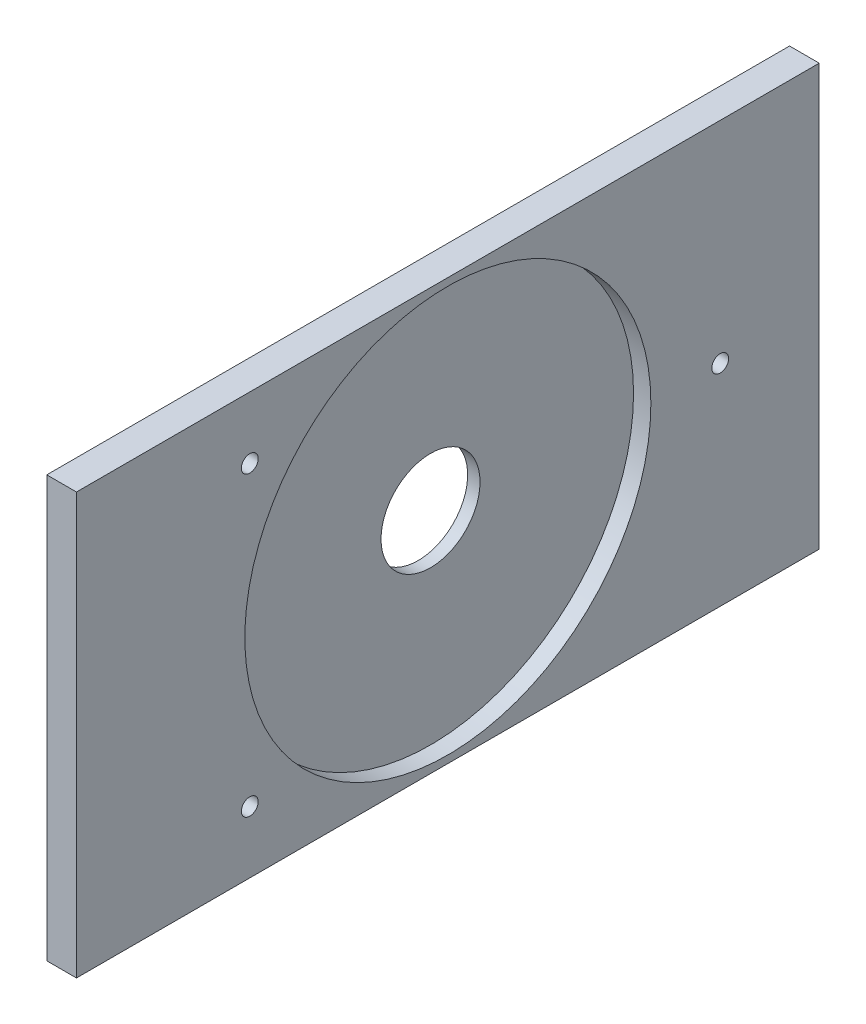
ISO-10303-21;
HEADER;
FILE_DESCRIPTION(('STEP AP214'),'2;1');
FILE_NAME('part.step','',(''),(''),'','','');
FILE_SCHEMA(('AUTOMOTIVE_DESIGN { 1 0 10303 214 1 1 1 1 }'));
ENDSEC;
DATA;
#1=APPLICATION_CONTEXT('core data for automotive mechanical design processes');
#2=APPLICATION_PROTOCOL_DEFINITION('international standard','automotive_design',2000,#1);
#3=PRODUCT_CONTEXT('',#1,'mechanical');
#4=PRODUCT('Part','Part','',(#3));
#5=PRODUCT_RELATED_PRODUCT_CATEGORY('part','',(#4));
#6=PRODUCT_DEFINITION_FORMATION('','',#4);
#7=PRODUCT_DEFINITION_CONTEXT('part definition',#1,'design');
#8=PRODUCT_DEFINITION('design','',#6,#7);
#9=PRODUCT_DEFINITION_SHAPE('','',#8);
#10=(LENGTH_UNIT() NAMED_UNIT(*) SI_UNIT(.MILLI.,.METRE.));
#11=(NAMED_UNIT(*) PLANE_ANGLE_UNIT() SI_UNIT($,.RADIAN.));
#12=(NAMED_UNIT(*) SI_UNIT($,.STERADIAN.) SOLID_ANGLE_UNIT());
#13=UNCERTAINTY_MEASURE_WITH_UNIT(LENGTH_MEASURE(1.E-05),#10,'distance_accuracy_value','');
#14=(GEOMETRIC_REPRESENTATION_CONTEXT(3) GLOBAL_UNCERTAINTY_ASSIGNED_CONTEXT((#13)) GLOBAL_UNIT_ASSIGNED_CONTEXT((#10,
#11,#12)) REPRESENTATION_CONTEXT('',''));
#15=CARTESIAN_POINT('',(0.,0.,0.));
#16=DIRECTION('',(0.,0.,1.));
#17=DIRECTION('',(1.,0.,0.));
#18=AXIS2_PLACEMENT_3D('',#15,#16,#17);
#19=CARTESIAN_POINT('',(141.167976474236,523.937350332489,386.309777683274));
#20=DIRECTION('',(0.,0.,-1.));
#21=DIRECTION('',(-1.,0.,0.));
#22=AXIS2_PLACEMENT_3D('',#19,#20,#21);
#23=PLANE('',#22);
#24=DIRECTION('',(0.,1.,0.));
#25=VECTOR('',#24,1.);
#26=CARTESIAN_POINT('',(-31.741420021431,523.937350332489,386.309777683274));
#27=LINE('',#26,#25);
#28=CARTESIAN_POINT('',(-31.741420021431,438.937350332489,386.309777683274));
#29=VERTEX_POINT('',#28);
#30=CARTESIAN_POINT('',(-31.741420021431,523.937350332489,386.309777683274));
#31=VERTEX_POINT('',#30);
#32=EDGE_CURVE('E42',#29,#31,#27,.T.);
#33=ORIENTED_EDGE('',*,*,#32,.F.);
#34=DIRECTION('',(-1.,0.,0.));
#35=VECTOR('',#34,1.);
#36=CARTESIAN_POINT('',(141.167976474236,438.937350332489,386.309777683274));
#37=LINE('',#36,#35);
#38=CARTESIAN_POINT('',(-37.741420021431,438.937350332489,386.309777683274));
#39=VERTEX_POINT('',#38);
#40=EDGE_CURVE('E70',#29,#39,#37,.T.);
#41=ORIENTED_EDGE('',*,*,#40,.T.);
#42=DIRECTION('',(0.,-1.,0.));
#43=VECTOR('',#42,1.);
#44=CARTESIAN_POINT('',(-37.741420021431,523.937350332489,386.309777683274));
#45=LINE('',#44,#43);
#46=CARTESIAN_POINT('',(-37.741420021431,523.937350332489,386.309777683274));
#47=VERTEX_POINT('',#46);
#48=EDGE_CURVE('E74',#47,#39,#45,.T.);
#49=ORIENTED_EDGE('',*,*,#48,.F.);
#50=DIRECTION('',(-1.,0.,0.));
#51=VECTOR('',#50,1.);
#52=CARTESIAN_POINT('',(141.167976474236,523.937350332489,386.309777683274));
#53=LINE('',#52,#51);
#54=EDGE_CURVE('E103',#31,#47,#53,.T.);
#55=ORIENTED_EDGE('',*,*,#54,.F.);
#56=EDGE_LOOP('',(#33,#41,#49,#55));
#57=FACE_BOUND('',#56,.T.);
#58=ADVANCED_FACE('F33',(#57),#23,.T.);
#59=CARTESIAN_POINT('',(141.167976474236,523.937350332489,386.309777683274));
#60=DIRECTION('',(0.,1.,0.));
#61=DIRECTION('',(-1.,0.,0.));
#62=AXIS2_PLACEMENT_3D('',#59,#60,#61);
#63=PLANE('',#62);
#64=DIRECTION('',(0.,0.,1.));
#65=VECTOR('',#64,1.);
#66=CARTESIAN_POINT('',(-31.741420021431,523.937350332489,386.309777683274));
#67=LINE('',#66,#65);
#68=CARTESIAN_POINT('',(-31.741420021431,523.937350332489,536.309777683274));
#69=VERTEX_POINT('',#68);
#70=EDGE_CURVE('E48',#31,#69,#67,.T.);
#71=ORIENTED_EDGE('',*,*,#70,.F.);
#72=ORIENTED_EDGE('',*,*,#54,.T.);
#73=DIRECTION('',(0.,0.,-1.));
#74=VECTOR('',#73,1.);
#75=CARTESIAN_POINT('',(-37.741420021431,523.937350332489,386.309777683274));
#76=LINE('',#75,#74);
#77=CARTESIAN_POINT('',(-37.741420021431,523.937350332489,536.309777683274));
#78=VERTEX_POINT('',#77);
#79=EDGE_CURVE('E78',#78,#47,#76,.T.);
#80=ORIENTED_EDGE('',*,*,#79,.F.);
#81=DIRECTION('',(-1.,0.,0.));
#82=VECTOR('',#81,1.);
#83=CARTESIAN_POINT('',(141.167976474236,523.937350332489,536.309777683274));
#84=LINE('',#83,#82);
#85=EDGE_CURVE('E107',#69,#78,#84,.T.);
#86=ORIENTED_EDGE('',*,*,#85,.F.);
#87=EDGE_LOOP('',(#71,#72,#80,#86));
#88=FACE_BOUND('',#87,.T.);
#89=ADVANCED_FACE('F113',(#88),#63,.T.);
#90=CARTESIAN_POINT('',(141.167976474236,523.937350332489,536.309777683274));
#91=DIRECTION('',(0.,0.,1.));
#92=DIRECTION('',(1.,0.,0.));
#93=AXIS2_PLACEMENT_3D('',#90,#91,#92);
#94=PLANE('',#93);
#95=DIRECTION('',(0.,-1.,0.));
#96=VECTOR('',#95,1.);
#97=CARTESIAN_POINT('',(-31.741420021431,523.937350332489,536.309777683274));
#98=LINE('',#97,#96);
#99=CARTESIAN_POINT('',(-31.741420021431,438.937350332489,536.309777683274));
#100=VERTEX_POINT('',#99);
#101=EDGE_CURVE('E101',#69,#100,#98,.T.);
#102=ORIENTED_EDGE('',*,*,#101,.F.);
#103=ORIENTED_EDGE('',*,*,#85,.T.);
#104=DIRECTION('',(0.,1.,0.));
#105=VECTOR('',#104,1.);
#106=CARTESIAN_POINT('',(-37.741420021431,523.937350332489,536.309777683274));
#107=LINE('',#106,#105);
#108=CARTESIAN_POINT('',(-37.741420021431,438.937350332489,536.309777683274));
#109=VERTEX_POINT('',#108);
#110=EDGE_CURVE('E87',#109,#78,#107,.T.);
#111=ORIENTED_EDGE('',*,*,#110,.F.);
#112=DIRECTION('',(-1.,0.,0.));
#113=VECTOR('',#112,1.);
#114=CARTESIAN_POINT('',(141.167976474236,438.937350332489,536.309777683274));
#115=LINE('',#114,#113);
#116=EDGE_CURVE('E77',#100,#109,#115,.T.);
#117=ORIENTED_EDGE('',*,*,#116,.F.);
#118=EDGE_LOOP('',(#102,#103,#111,#117));
#119=FACE_BOUND('',#118,.T.);
#120=ADVANCED_FACE('F111',(#119),#94,.T.);
#121=CARTESIAN_POINT('',(141.167976474236,438.937350332489,386.309777683274));
#122=DIRECTION('',(0.,-1.,0.));
#123=DIRECTION('',(1.,0.,0.));
#124=AXIS2_PLACEMENT_3D('',#121,#122,#123);
#125=PLANE('',#124);
#126=DIRECTION('',(0.,0.,-1.));
#127=VECTOR('',#126,1.);
#128=CARTESIAN_POINT('',(-31.741420021431,438.937350332489,386.309777683274));
#129=LINE('',#128,#127);
#130=EDGE_CURVE('E12',#100,#29,#129,.T.);
#131=ORIENTED_EDGE('',*,*,#130,.F.);
#132=ORIENTED_EDGE('',*,*,#116,.T.);
#133=DIRECTION('',(0.,0.,1.));
#134=VECTOR('',#133,1.);
#135=CARTESIAN_POINT('',(-37.741420021431,438.937350332489,386.309777683274));
#136=LINE('',#135,#134);
#137=EDGE_CURVE('E81',#39,#109,#136,.T.);
#138=ORIENTED_EDGE('',*,*,#137,.F.);
#139=ORIENTED_EDGE('',*,*,#40,.F.);
#140=EDGE_LOOP('',(#131,#132,#138,#139));
#141=FACE_BOUND('',#140,.T.);
#142=ADVANCED_FACE('F82',(#141),#125,.T.);
#143=CARTESIAN_POINT('',(-31.741420021431,491.437350332474,461.309760229981));
#144=DIRECTION('',(-1.,0.,0.));
#145=DIRECTION('',(0.,1.74532925137014E-06,0.999999999998477));
#146=AXIS2_PLACEMENT_3D('',#143,#144,#145);
#147=PLANE('',#146);
#148=CARTESIAN_POINT('',(-31.741420021431,451.437350332489,501.309777683274));
#149=DIRECTION('',(-1.,0.,0.));
#150=DIRECTION('',(0.,0.,1.));
#151=AXIS2_PLACEMENT_3D('',#148,#149,#150);
#152=CIRCLE('',#151,1.70000000000008);
#153=CARTESIAN_POINT('',(-31.741420021431,451.437350332489,503.009777683274));
#154=VERTEX_POINT('',#153);
#155=EDGE_CURVE('E137',#154,#154,#152,.T.);
#156=ORIENTED_EDGE('',*,*,#155,.T.);
#157=EDGE_LOOP('',(#156));
#158=FACE_BOUND('',#157,.T.);
#159=CARTESIAN_POINT('',(-31.741420021431,481.437350332489,406.309777683274));
#160=DIRECTION('',(-1.,0.,0.));
#161=DIRECTION('',(0.,0.,1.));
#162=AXIS2_PLACEMENT_3D('',#159,#160,#161);
#163=CIRCLE('',#162,1.69999999999995);
#164=CARTESIAN_POINT('',(-31.741420021431,481.437350332489,408.009777683274));
#165=VERTEX_POINT('',#164);
#166=EDGE_CURVE('E141',#165,#165,#163,.T.);
#167=ORIENTED_EDGE('',*,*,#166,.T.);
#168=EDGE_LOOP('',(#167));
#169=FACE_BOUND('',#168,.T.);
#170=CARTESIAN_POINT('',(-31.741420021431,511.437350332489,501.309777683274));
#171=DIRECTION('',(-1.,0.,0.));
#172=DIRECTION('',(0.,0.,1.));
#173=AXIS2_PLACEMENT_3D('',#170,#171,#172);
#174=CIRCLE('',#173,1.70000000000006);
#175=CARTESIAN_POINT('',(-31.741420021431,511.437350332489,503.009777683274));
#176=VERTEX_POINT('',#175);
#177=EDGE_CURVE('E145',#176,#176,#174,.T.);
#178=ORIENTED_EDGE('',*,*,#177,.T.);
#179=EDGE_LOOP('',(#178));
#180=FACE_BOUND('',#179,.T.);
#181=CARTESIAN_POINT('',(-31.741420021431,481.437350332489,461.309777683274));
#182=DIRECTION('',(1.,0.,0.));
#183=DIRECTION('',(0.,0.,-1.));
#184=AXIS2_PLACEMENT_3D('',#181,#182,#183);
#185=CIRCLE('',#184,41.);
#186=CARTESIAN_POINT('',(-31.741420021431,481.437350332489,420.309777683274));
#187=VERTEX_POINT('',#186);
#188=EDGE_CURVE('E95',#187,#187,#185,.T.);
#189=ORIENTED_EDGE('',*,*,#188,.F.);
#190=EDGE_LOOP('',(#189));
#191=FACE_BOUND('',#190,.T.);
#192=ORIENTED_EDGE('',*,*,#32,.T.);
#193=ORIENTED_EDGE('',*,*,#70,.T.);
#194=ORIENTED_EDGE('',*,*,#101,.T.);
#195=ORIENTED_EDGE('',*,*,#130,.T.);
#196=EDGE_LOOP('',(#192,#193,#194,#195));
#197=FACE_BOUND('',#196,.T.);
#198=ADVANCED_FACE('F122',(#158,#169,#180,#191,#197),#147,.F.);
#199=CARTESIAN_POINT('',(-37.741420021431,0.,0.));
#200=DIRECTION('',(-1.,0.,0.));
#201=DIRECTION('',(0.,0.,1.));
#202=AXIS2_PLACEMENT_3D('',#199,#200,#201);
#203=PLANE('',#202);
#204=CARTESIAN_POINT('',(-37.741420021431,451.437350332489,501.309777683274));
#205=DIRECTION('',(-1.,0.,0.));
#206=DIRECTION('',(0.,0.,1.));
#207=AXIS2_PLACEMENT_3D('',#204,#205,#206);
#208=CIRCLE('',#207,1.70000000000008);
#209=CARTESIAN_POINT('',(-37.741420021431,451.437350332489,503.009777683274));
#210=VERTEX_POINT('',#209);
#211=EDGE_CURVE('E166',#210,#210,#208,.T.);
#212=ORIENTED_EDGE('',*,*,#211,.F.);
#213=EDGE_LOOP('',(#212));
#214=FACE_BOUND('',#213,.T.);
#215=CARTESIAN_POINT('',(-37.741420021431,481.437350332489,406.309777683274));
#216=DIRECTION('',(-1.,0.,0.));
#217=DIRECTION('',(0.,0.,1.));
#218=AXIS2_PLACEMENT_3D('',#215,#216,#217);
#219=CIRCLE('',#218,1.69999999999995);
#220=CARTESIAN_POINT('',(-37.741420021431,481.437350332489,408.009777683274));
#221=VERTEX_POINT('',#220);
#222=EDGE_CURVE('E162',#221,#221,#219,.T.);
#223=ORIENTED_EDGE('',*,*,#222,.F.);
#224=EDGE_LOOP('',(#223));
#225=FACE_BOUND('',#224,.T.);
#226=CARTESIAN_POINT('',(-37.741420021431,511.437350332489,501.309777683274));
#227=DIRECTION('',(-1.,0.,0.));
#228=DIRECTION('',(0.,0.,1.));
#229=AXIS2_PLACEMENT_3D('',#226,#227,#228);
#230=CIRCLE('',#229,1.70000000000006);
#231=CARTESIAN_POINT('',(-37.741420021431,511.437350332489,503.009777683274));
#232=VERTEX_POINT('',#231);
#233=EDGE_CURVE('E157',#232,#232,#230,.T.);
#234=ORIENTED_EDGE('',*,*,#233,.F.);
#235=EDGE_LOOP('',(#234));
#236=FACE_BOUND('',#235,.T.);
#237=CARTESIAN_POINT('',(-37.741420021431,481.437350332489,461.309777683274));
#238=DIRECTION('',(-1.,0.,0.));
#239=DIRECTION('',(0.,0.,1.));
#240=AXIS2_PLACEMENT_3D('',#237,#238,#239);
#241=CIRCLE('',#240,9.99999999999998);
#242=CARTESIAN_POINT('',(-37.741420021431,481.437350332489,471.309777683274));
#243=VERTEX_POINT('',#242);
#244=EDGE_CURVE('E150',#243,#243,#241,.T.);
#245=ORIENTED_EDGE('',*,*,#244,.F.);
#246=EDGE_LOOP('',(#245));
#247=FACE_BOUND('',#246,.T.);
#248=ORIENTED_EDGE('',*,*,#48,.T.);
#249=ORIENTED_EDGE('',*,*,#137,.T.);
#250=ORIENTED_EDGE('',*,*,#110,.T.);
#251=ORIENTED_EDGE('',*,*,#79,.T.);
#252=EDGE_LOOP('',(#248,#249,#250,#251));
#253=FACE_BOUND('',#252,.T.);
#254=ADVANCED_FACE('F90',(#214,#225,#236,#247,#253),#203,.T.);
#255=CARTESIAN_POINT('',(-35.241420021431,481.437350332489,461.309777683274));
#256=DIRECTION('',(1.,0.,0.));
#257=DIRECTION('',(0.,0.,-1.));
#258=AXIS2_PLACEMENT_3D('',#255,#256,#257);
#259=CYLINDRICAL_SURFACE('',#258,41.);
#260=CARTESIAN_POINT('',(-35.241420021431,481.437350332489,461.309777683274));
#261=DIRECTION('',(1.,0.,0.));
#262=DIRECTION('',(0.,0.,-1.));
#263=AXIS2_PLACEMENT_3D('',#260,#261,#262);
#264=CIRCLE('',#263,41.);
#265=CARTESIAN_POINT('',(-35.241420021431,481.437350332489,420.309777683274));
#266=VERTEX_POINT('',#265);
#267=EDGE_CURVE('E92',#266,#266,#264,.T.);
#268=ORIENTED_EDGE('',*,*,#267,.F.);
#269=EDGE_LOOP('',(#268));
#270=FACE_BOUND('',#269,.T.);
#271=ORIENTED_EDGE('',*,*,#188,.T.);
#272=EDGE_LOOP('',(#271));
#273=FACE_BOUND('',#272,.T.);
#274=ADVANCED_FACE('F132',(#270,#273),#259,.F.);
#275=CARTESIAN_POINT('',(-35.241420021431,481.437350332489,461.309777683274));
#276=DIRECTION('',(1.,0.,0.));
#277=DIRECTION('',(0.,0.,-1.));
#278=AXIS2_PLACEMENT_3D('',#275,#276,#277);
#279=PLANE('',#278);
#280=CARTESIAN_POINT('',(-35.241420021431,481.437350332489,461.309777683274));
#281=DIRECTION('',(1.,0.,0.));
#282=DIRECTION('',(0.,0.,-1.));
#283=AXIS2_PLACEMENT_3D('',#280,#281,#282);
#284=CIRCLE('',#283,9.99999999999998);
#285=CARTESIAN_POINT('',(-35.241420021431,481.437350332489,451.309777683274));
#286=VERTEX_POINT('',#285);
#287=EDGE_CURVE('E36',#286,#286,#284,.T.);
#288=ORIENTED_EDGE('',*,*,#287,.F.);
#289=EDGE_LOOP('',(#288));
#290=FACE_BOUND('',#289,.T.);
#291=ORIENTED_EDGE('',*,*,#267,.T.);
#292=EDGE_LOOP('',(#291));
#293=FACE_BOUND('',#292,.T.);
#294=ADVANCED_FACE('F190',(#290,#293),#279,.T.);
#295=CARTESIAN_POINT('',(-31.741420021431,481.437350332489,461.309777683274));
#296=DIRECTION('',(-1.,0.,0.));
#297=DIRECTION('',(0.,0.,1.));
#298=AXIS2_PLACEMENT_3D('',#295,#296,#297);
#299=CYLINDRICAL_SURFACE('',#298,9.99999999999998);
#300=ORIENTED_EDGE('',*,*,#287,.T.);
#301=EDGE_LOOP('',(#300));
#302=FACE_BOUND('',#301,.T.);
#303=ORIENTED_EDGE('',*,*,#244,.T.);
#304=EDGE_LOOP('',(#303));
#305=FACE_BOUND('',#304,.T.);
#306=ADVANCED_FACE('F181',(#302,#305),#299,.F.);
#307=CARTESIAN_POINT('',(-31.741420021431,511.437350332489,501.309777683274));
#308=DIRECTION('',(-1.,0.,0.));
#309=DIRECTION('',(0.,0.,1.));
#310=AXIS2_PLACEMENT_3D('',#307,#308,#309);
#311=CYLINDRICAL_SURFACE('',#310,1.70000000000006);
#312=ORIENTED_EDGE('',*,*,#177,.F.);
#313=EDGE_LOOP('',(#312));
#314=FACE_BOUND('',#313,.T.);
#315=ORIENTED_EDGE('',*,*,#233,.T.);
#316=EDGE_LOOP('',(#315));
#317=FACE_BOUND('',#316,.T.);
#318=ADVANCED_FACE('F178',(#314,#317),#311,.F.);
#319=CARTESIAN_POINT('',(-31.741420021431,481.437350332489,406.309777683274));
#320=DIRECTION('',(-1.,0.,0.));
#321=DIRECTION('',(0.,0.,1.));
#322=AXIS2_PLACEMENT_3D('',#319,#320,#321);
#323=CYLINDRICAL_SURFACE('',#322,1.69999999999995);
#324=ORIENTED_EDGE('',*,*,#166,.F.);
#325=EDGE_LOOP('',(#324));
#326=FACE_BOUND('',#325,.T.);
#327=ORIENTED_EDGE('',*,*,#222,.T.);
#328=EDGE_LOOP('',(#327));
#329=FACE_BOUND('',#328,.T.);
#330=ADVANCED_FACE('F180',(#326,#329),#323,.F.);
#331=CARTESIAN_POINT('',(-31.741420021431,451.437350332489,501.309777683274));
#332=DIRECTION('',(-1.,0.,0.));
#333=DIRECTION('',(0.,0.,1.));
#334=AXIS2_PLACEMENT_3D('',#331,#332,#333);
#335=CYLINDRICAL_SURFACE('',#334,1.70000000000008);
#336=ORIENTED_EDGE('',*,*,#155,.F.);
#337=EDGE_LOOP('',(#336));
#338=FACE_BOUND('',#337,.T.);
#339=ORIENTED_EDGE('',*,*,#211,.T.);
#340=EDGE_LOOP('',(#339));
#341=FACE_BOUND('',#340,.T.);
#342=ADVANCED_FACE('F171',(#338,#341),#335,.F.);
#343=CLOSED_SHELL('',(#58,#89,#120,#142,#198,#254,#274,#294,#306,#318,#330,#342));
#344=MANIFOLD_SOLID_BREP('B2',#343);
#345=ADVANCED_BREP_SHAPE_REPRESENTATION('',(#18,#344),#14);
#346=SHAPE_DEFINITION_REPRESENTATION(#9,#345);
ENDSEC;
END-ISO-10303-21;
